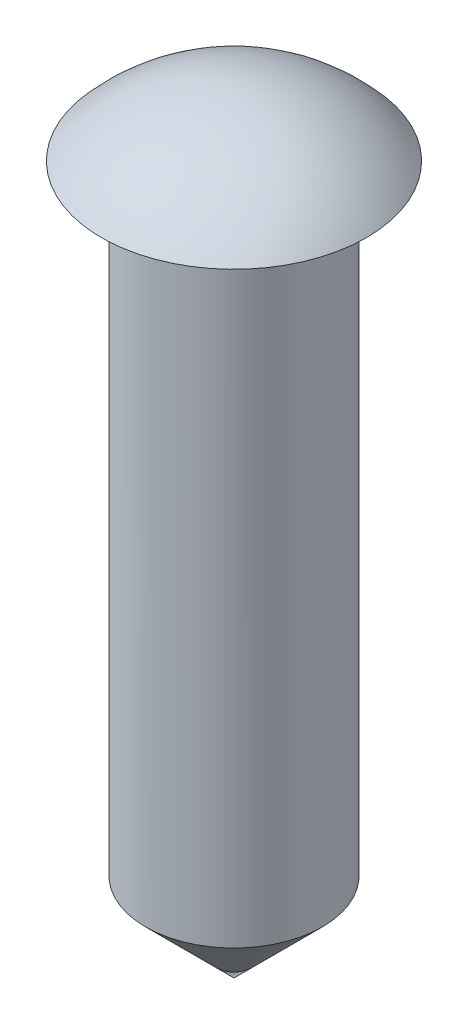
ISO-10303-21;
HEADER;
FILE_DESCRIPTION(('STEP AP214'),'2;1');
FILE_NAME('part.step','',(''),(''),'','','');
FILE_SCHEMA(('AUTOMOTIVE_DESIGN { 1 0 10303 214 1 1 1 1 }'));
ENDSEC;
DATA;
#1=APPLICATION_CONTEXT('core data for automotive mechanical design processes');
#2=APPLICATION_PROTOCOL_DEFINITION('international standard','automotive_design',2000,#1);
#3=PRODUCT_CONTEXT('',#1,'mechanical');
#4=PRODUCT('Part','Part','',(#3));
#5=PRODUCT_RELATED_PRODUCT_CATEGORY('part','',(#4));
#6=PRODUCT_DEFINITION_FORMATION('','',#4);
#7=PRODUCT_DEFINITION_CONTEXT('part definition',#1,'design');
#8=PRODUCT_DEFINITION('design','',#6,#7);
#9=PRODUCT_DEFINITION_SHAPE('','',#8);
#10=(LENGTH_UNIT() NAMED_UNIT(*) SI_UNIT(.MILLI.,.METRE.));
#11=(NAMED_UNIT(*) PLANE_ANGLE_UNIT() SI_UNIT($,.RADIAN.));
#12=(NAMED_UNIT(*) SI_UNIT($,.STERADIAN.) SOLID_ANGLE_UNIT());
#13=UNCERTAINTY_MEASURE_WITH_UNIT(LENGTH_MEASURE(1.E-05),#10,'distance_accuracy_value','');
#14=(GEOMETRIC_REPRESENTATION_CONTEXT(3) GLOBAL_UNCERTAINTY_ASSIGNED_CONTEXT((#13)) GLOBAL_UNIT_ASSIGNED_CONTEXT((#10,
#11,#12)) REPRESENTATION_CONTEXT('',''));
#15=CARTESIAN_POINT('',(0.,0.,0.));
#16=DIRECTION('',(0.,0.,1.));
#17=DIRECTION('',(1.,0.,0.));
#18=AXIS2_PLACEMENT_3D('',#15,#16,#17);
#19=CARTESIAN_POINT('',(0.,-3.,0.));
#20=DIRECTION('',(0.,-1.,0.));
#21=DIRECTION('',(1.,0.,0.));
#22=AXIS2_PLACEMENT_3D('',#19,#20,#21);
#23=SPHERICAL_SURFACE('',#22,3.);
#24=CARTESIAN_POINT('',(0.,-1.01568651670155,0.));
#25=DIRECTION('',(0.,-1.,0.));
#26=DIRECTION('',(1.,0.,0.));
#27=AXIS2_PLACEMENT_3D('',#24,#25,#26);
#28=CIRCLE('',#27,2.25);
#29=CARTESIAN_POINT('',(2.25,-1.01568651670155,0.));
#30=VERTEX_POINT('',#29);
#31=EDGE_CURVE('E11',#30,#30,#28,.T.);
#32=ORIENTED_EDGE('',*,*,#31,.F.);
#33=EDGE_LOOP('',(#32));
#34=FACE_BOUND('',#33,.T.);
#35=ADVANCED_FACE('F33',(#34),#23,.T.);
#36=CARTESIAN_POINT('',(-2.25,-1.01568651670156,0.));
#37=DIRECTION('',(0.,1.,0.));
#38=DIRECTION('',(-1.,0.,0.));
#39=AXIS2_PLACEMENT_3D('',#36,#37,#38);
#40=PLANE('',#39);
#41=CARTESIAN_POINT('',(0.,-1.01568651670155,0.));
#42=DIRECTION('',(0.,-1.,0.));
#43=DIRECTION('',(1.,0.,0.));
#44=AXIS2_PLACEMENT_3D('',#41,#42,#43);
#45=CIRCLE('',#44,1.5);
#46=CARTESIAN_POINT('',(1.5,-1.01568651670155,0.));
#47=VERTEX_POINT('',#46);
#48=EDGE_CURVE('E39',#47,#47,#45,.T.);
#49=ORIENTED_EDGE('',*,*,#48,.F.);
#50=EDGE_LOOP('',(#49));
#51=FACE_BOUND('',#50,.T.);
#52=ORIENTED_EDGE('',*,*,#31,.T.);
#53=EDGE_LOOP('',(#52));
#54=FACE_BOUND('',#53,.T.);
#55=ADVANCED_FACE('F56',(#51,#54),#40,.F.);
#56=CARTESIAN_POINT('',(0.,-13.0156865167016,0.));
#57=DIRECTION('',(0.,-1.,0.));
#58=DIRECTION('',(1.,0.,0.));
#59=AXIS2_PLACEMENT_3D('',#56,#57,#58);
#60=CYLINDRICAL_SURFACE('',#59,1.5);
#61=CARTESIAN_POINT('',(0.,-11.5156865167015,0.));
#62=DIRECTION('',(0.,-1.,0.));
#63=DIRECTION('',(1.,0.,0.));
#64=AXIS2_PLACEMENT_3D('',#61,#62,#63);
#65=CIRCLE('',#64,1.5);
#66=CARTESIAN_POINT('',(1.5,-11.5156865167015,0.));
#67=VERTEX_POINT('',#66);
#68=EDGE_CURVE('E49',#67,#67,#65,.T.);
#69=ORIENTED_EDGE('',*,*,#68,.F.);
#70=EDGE_LOOP('',(#69));
#71=FACE_BOUND('',#70,.T.);
#72=ORIENTED_EDGE('',*,*,#48,.T.);
#73=EDGE_LOOP('',(#72));
#74=FACE_BOUND('',#73,.T.);
#75=ADVANCED_FACE('F45',(#71,#74),#60,.T.);
#76=CARTESIAN_POINT('',(0.,-11.5156865167015,0.));
#77=DIRECTION('',(0.,1.,0.));
#78=DIRECTION('',(-1.,0.,0.));
#79=AXIS2_PLACEMENT_3D('',#76,#77,#78);
#80=CONICAL_SURFACE('',#79,1.5,0.785398163397443);
#81=CARTESIAN_POINT('',(0.,-13.0156865167016,0.));
#82=VERTEX_POINT('',#81);
#83=VERTEX_LOOP('',#82);
#84=FACE_BOUND('',#83,.T.);
#85=ORIENTED_EDGE('',*,*,#68,.T.);
#86=EDGE_LOOP('',(#85));
#87=FACE_BOUND('',#86,.T.);
#88=ADVANCED_FACE('F42',(#84,#87),#80,.T.);
#89=CLOSED_SHELL('',(#35,#55,#75,#88));
#90=MANIFOLD_SOLID_BREP('B2',#89);
#91=ADVANCED_BREP_SHAPE_REPRESENTATION('',(#18,#90),#14);
#92=SHAPE_DEFINITION_REPRESENTATION(#9,#91);
ENDSEC;
END-ISO-10303-21;
